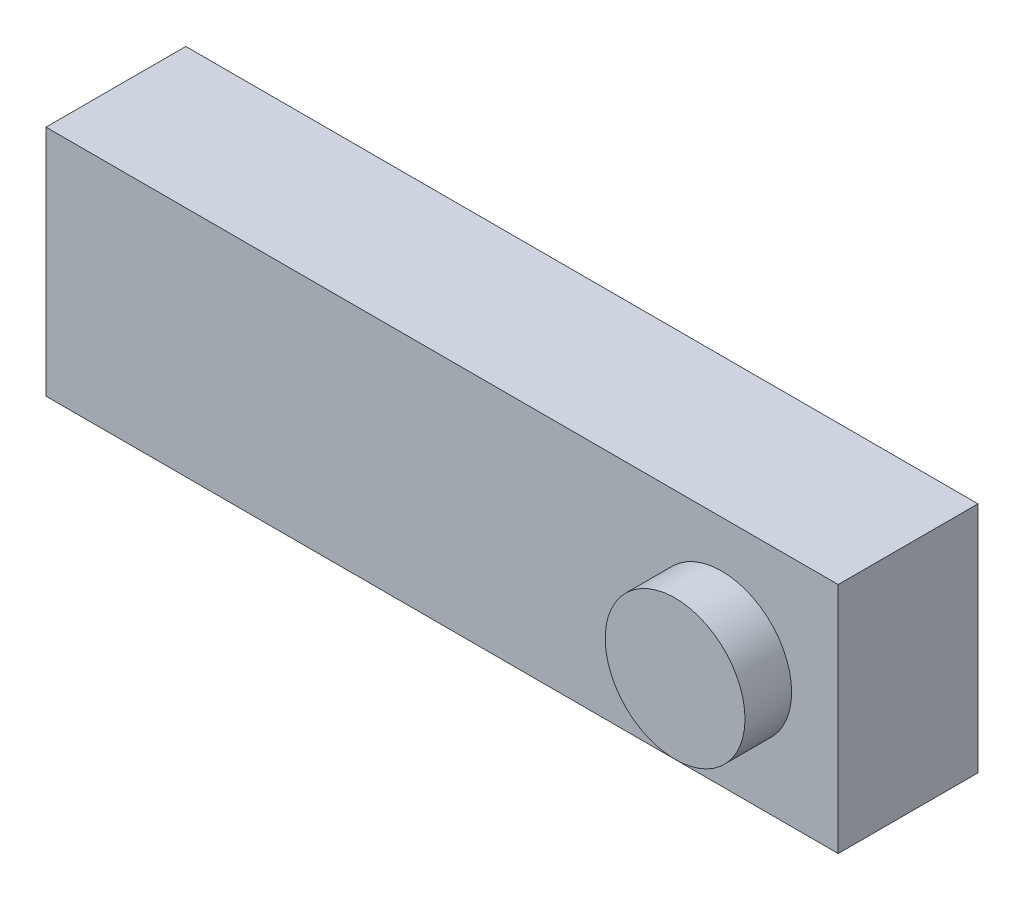
ISO-10303-21;
HEADER;
FILE_DESCRIPTION(('STEP AP214'),'2;1');
FILE_NAME('part.step','',(''),(''),'','','');
FILE_SCHEMA(('AUTOMOTIVE_DESIGN { 1 0 10303 214 1 1 1 1 }'));
ENDSEC;
DATA;
#1=APPLICATION_CONTEXT('core data for automotive mechanical design processes');
#2=APPLICATION_PROTOCOL_DEFINITION('international standard','automotive_design',2000,#1);
#3=PRODUCT_CONTEXT('',#1,'mechanical');
#4=PRODUCT('Part','Part','',(#3));
#5=PRODUCT_RELATED_PRODUCT_CATEGORY('part','',(#4));
#6=PRODUCT_DEFINITION_FORMATION('','',#4);
#7=PRODUCT_DEFINITION_CONTEXT('part definition',#1,'design');
#8=PRODUCT_DEFINITION('design','',#6,#7);
#9=PRODUCT_DEFINITION_SHAPE('','',#8);
#10=(LENGTH_UNIT() NAMED_UNIT(*) SI_UNIT(.MILLI.,.METRE.));
#11=(NAMED_UNIT(*) PLANE_ANGLE_UNIT() SI_UNIT($,.RADIAN.));
#12=(NAMED_UNIT(*) SI_UNIT($,.STERADIAN.) SOLID_ANGLE_UNIT());
#13=UNCERTAINTY_MEASURE_WITH_UNIT(LENGTH_MEASURE(1.E-05),#10,'distance_accuracy_value','');
#14=(GEOMETRIC_REPRESENTATION_CONTEXT(3) GLOBAL_UNCERTAINTY_ASSIGNED_CONTEXT((#13)) GLOBAL_UNIT_ASSIGNED_CONTEXT((#10,
#11,#12)) REPRESENTATION_CONTEXT('',''));
#15=CARTESIAN_POINT('',(0.,0.,0.));
#16=DIRECTION('',(0.,0.,1.));
#17=DIRECTION('',(1.,0.,0.));
#18=AXIS2_PLACEMENT_3D('',#15,#16,#17);
#19=CARTESIAN_POINT('',(491.834843653032,1149.02699768533,153.1716134156));
#20=DIRECTION('',(1.,0.,0.));
#21=DIRECTION('',(0.,0.,-1.));
#22=AXIS2_PLACEMENT_3D('',#19,#20,#21);
#23=PLANE('',#22);
#24=DIRECTION('',(0.,-1.,0.));
#25=VECTOR('',#24,1.);
#26=CARTESIAN_POINT('',(491.834843653032,1149.02699768533,3.17161341559968));
#27=LINE('',#26,#25);
#28=CARTESIAN_POINT('',(491.834843653032,1149.02699768533,3.17161341559968));
#29=VERTEX_POINT('',#28);
#30=CARTESIAN_POINT('',(491.834843653032,899.026997685325,3.17161341559968));
#31=VERTEX_POINT('',#30);
#32=EDGE_CURVE('E96',#29,#31,#27,.T.);
#33=ORIENTED_EDGE('',*,*,#32,.T.);
#34=DIRECTION('',(0.,0.,-1.));
#35=VECTOR('',#34,1.);
#36=CARTESIAN_POINT('',(491.834843653032,899.026997685325,153.1716134156));
#37=LINE('',#36,#35);
#38=CARTESIAN_POINT('',(491.834843653032,899.026997685325,153.1716134156));
#39=VERTEX_POINT('',#38);
#40=EDGE_CURVE('E11',#39,#31,#37,.T.);
#41=ORIENTED_EDGE('',*,*,#40,.F.);
#42=DIRECTION('',(0.,-1.,0.));
#43=VECTOR('',#42,1.);
#44=CARTESIAN_POINT('',(491.834843653032,1149.02699768533,153.1716134156));
#45=LINE('',#44,#43);
#46=CARTESIAN_POINT('',(491.834843653032,1149.02699768533,153.1716134156));
#47=VERTEX_POINT('',#46);
#48=EDGE_CURVE('E84',#47,#39,#45,.T.);
#49=ORIENTED_EDGE('',*,*,#48,.F.);
#50=DIRECTION('',(0.,0.,-1.));
#51=VECTOR('',#50,1.);
#52=CARTESIAN_POINT('',(491.834843653032,1149.02699768533,153.1716134156));
#53=LINE('',#52,#51);
#54=EDGE_CURVE('E92',#47,#29,#53,.T.);
#55=ORIENTED_EDGE('',*,*,#54,.T.);
#56=EDGE_LOOP('',(#33,#41,#49,#55));
#57=FACE_BOUND('',#56,.T.);
#58=ADVANCED_FACE('F33',(#57),#23,.F.);
#59=CARTESIAN_POINT('',(491.834843653032,899.026997685325,153.1716134156));
#60=DIRECTION('',(0.,1.,0.));
#61=DIRECTION('',(0.,0.,1.));
#62=AXIS2_PLACEMENT_3D('',#59,#60,#61);
#63=PLANE('',#62);
#64=DIRECTION('',(1.,0.,0.));
#65=VECTOR('',#64,1.);
#66=CARTESIAN_POINT('',(491.834843653032,899.026997685325,3.17161341559968));
#67=LINE('',#66,#65);
#68=CARTESIAN_POINT('',(1341.83484365303,899.026997685325,3.17161341559968));
#69=VERTEX_POINT('',#68);
#70=EDGE_CURVE('E88',#31,#69,#67,.T.);
#71=ORIENTED_EDGE('',*,*,#70,.T.);
#72=DIRECTION('',(0.,0.,-1.));
#73=VECTOR('',#72,1.);
#74=CARTESIAN_POINT('',(1341.83484365303,899.026997685325,153.1716134156));
#75=LINE('',#74,#73);
#76=CARTESIAN_POINT('',(1341.83484365303,899.026997685325,153.1716134156));
#77=VERTEX_POINT('',#76);
#78=EDGE_CURVE('E41',#77,#69,#75,.T.);
#79=ORIENTED_EDGE('',*,*,#78,.F.);
#80=DIRECTION('',(1.,0.,0.));
#81=VECTOR('',#80,1.);
#82=CARTESIAN_POINT('',(491.834843653032,899.026997685325,153.1716134156));
#83=LINE('',#82,#81);
#84=EDGE_CURVE('E79',#39,#77,#83,.T.);
#85=ORIENTED_EDGE('',*,*,#84,.F.);
#86=ORIENTED_EDGE('',*,*,#40,.T.);
#87=EDGE_LOOP('',(#71,#79,#85,#86));
#88=FACE_BOUND('',#87,.T.);
#89=ADVANCED_FACE('F87',(#88),#63,.F.);
#90=CARTESIAN_POINT('',(1341.83484365303,1149.02699768533,153.1716134156));
#91=DIRECTION('',(-1.,0.,0.));
#92=DIRECTION('',(0.,0.,1.));
#93=AXIS2_PLACEMENT_3D('',#90,#91,#92);
#94=PLANE('',#93);
#95=DIRECTION('',(0.,1.,0.));
#96=VECTOR('',#95,1.);
#97=CARTESIAN_POINT('',(1341.83484365303,1149.02699768533,3.17161341559968));
#98=LINE('',#97,#96);
#99=CARTESIAN_POINT('',(1341.83484365303,1149.02699768533,3.17161341559968));
#100=VERTEX_POINT('',#99);
#101=EDGE_CURVE('E66',#69,#100,#98,.T.);
#102=ORIENTED_EDGE('',*,*,#101,.T.);
#103=DIRECTION('',(0.,0.,-1.));
#104=VECTOR('',#103,1.);
#105=CARTESIAN_POINT('',(1341.83484365303,1149.02699768533,153.1716134156));
#106=LINE('',#105,#104);
#107=CARTESIAN_POINT('',(1341.83484365303,1149.02699768533,153.1716134156));
#108=VERTEX_POINT('',#107);
#109=EDGE_CURVE('E89',#108,#100,#106,.T.);
#110=ORIENTED_EDGE('',*,*,#109,.F.);
#111=DIRECTION('',(0.,1.,0.));
#112=VECTOR('',#111,1.);
#113=CARTESIAN_POINT('',(1341.83484365303,1149.02699768533,153.1716134156));
#114=LINE('',#113,#112);
#115=EDGE_CURVE('E82',#77,#108,#114,.T.);
#116=ORIENTED_EDGE('',*,*,#115,.F.);
#117=ORIENTED_EDGE('',*,*,#78,.T.);
#118=EDGE_LOOP('',(#102,#110,#116,#117));
#119=FACE_BOUND('',#118,.T.);
#120=ADVANCED_FACE('F90',(#119),#94,.F.);
#121=CARTESIAN_POINT('',(491.834843653032,1149.02699768533,153.1716134156));
#122=DIRECTION('',(0.,-1.,0.));
#123=DIRECTION('',(0.,0.,-1.));
#124=AXIS2_PLACEMENT_3D('',#121,#122,#123);
#125=PLANE('',#124);
#126=DIRECTION('',(-1.,0.,0.));
#127=VECTOR('',#126,1.);
#128=CARTESIAN_POINT('',(491.834843653032,1149.02699768533,3.17161341559968));
#129=LINE('',#128,#127);
#130=EDGE_CURVE('E72',#100,#29,#129,.T.);
#131=ORIENTED_EDGE('',*,*,#130,.T.);
#132=ORIENTED_EDGE('',*,*,#54,.F.);
#133=DIRECTION('',(-1.,0.,0.));
#134=VECTOR('',#133,1.);
#135=CARTESIAN_POINT('',(491.834843653032,1149.02699768533,153.1716134156));
#136=LINE('',#135,#134);
#137=EDGE_CURVE('E49',#108,#47,#136,.T.);
#138=ORIENTED_EDGE('',*,*,#137,.F.);
#139=ORIENTED_EDGE('',*,*,#109,.T.);
#140=EDGE_LOOP('',(#131,#132,#138,#139));
#141=FACE_BOUND('',#140,.T.);
#142=ADVANCED_FACE('F104',(#141),#125,.F.);
#143=CARTESIAN_POINT('',(0.,0.,153.1716134156));
#144=DIRECTION('',(0.,0.,1.));
#145=DIRECTION('',(1.,0.,0.));
#146=AXIS2_PLACEMENT_3D('',#143,#144,#145);
#147=PLANE('',#146);
#148=CARTESIAN_POINT('',(1216.83484365303,1024.02699768533,153.1716134156));
#149=DIRECTION('',(0.,0.,1.));
#150=DIRECTION('',(1.,0.,0.));
#151=AXIS2_PLACEMENT_3D('',#148,#149,#150);
#152=CIRCLE('',#151,75.);
#153=CARTESIAN_POINT('',(1291.83484365303,1024.02699768533,153.1716134156));
#154=VERTEX_POINT('',#153);
#155=EDGE_CURVE('E116',#154,#154,#152,.T.);
#156=ORIENTED_EDGE('',*,*,#155,.F.);
#157=EDGE_LOOP('',(#156));
#158=FACE_BOUND('',#157,.T.);
#159=ORIENTED_EDGE('',*,*,#48,.T.);
#160=ORIENTED_EDGE('',*,*,#84,.T.);
#161=ORIENTED_EDGE('',*,*,#115,.T.);
#162=ORIENTED_EDGE('',*,*,#137,.T.);
#163=EDGE_LOOP('',(#159,#160,#161,#162));
#164=FACE_BOUND('',#163,.T.);
#165=ADVANCED_FACE('F80',(#158,#164),#147,.T.);
#166=CARTESIAN_POINT('',(0.,0.,3.17161341559968));
#167=DIRECTION('',(0.,0.,1.));
#168=DIRECTION('',(1.,0.,0.));
#169=AXIS2_PLACEMENT_3D('',#166,#167,#168);
#170=PLANE('',#169);
#171=CARTESIAN_POINT('',(616.834843653032,1024.02699768533,3.17161341559968));
#172=DIRECTION('',(0.,0.,-1.));
#173=DIRECTION('',(-1.,0.,0.));
#174=AXIS2_PLACEMENT_3D('',#171,#172,#173);
#175=CIRCLE('',#174,75.);
#176=CARTESIAN_POINT('',(541.834843653032,1024.02699768533,3.17161341559968));
#177=VERTEX_POINT('',#176);
#178=EDGE_CURVE('E110',#177,#177,#175,.T.);
#179=ORIENTED_EDGE('',*,*,#178,.F.);
#180=EDGE_LOOP('',(#179));
#181=FACE_BOUND('',#180,.T.);
#182=ORIENTED_EDGE('',*,*,#32,.F.);
#183=ORIENTED_EDGE('',*,*,#130,.F.);
#184=ORIENTED_EDGE('',*,*,#101,.F.);
#185=ORIENTED_EDGE('',*,*,#70,.F.);
#186=EDGE_LOOP('',(#182,#183,#184,#185));
#187=FACE_BOUND('',#186,.T.);
#188=ADVANCED_FACE('F107',(#181,#187),#170,.F.);
#189=CARTESIAN_POINT('',(616.834843653032,1024.02699768533,53.1716134155997));
#190=DIRECTION('',(0.,0.,-1.));
#191=DIRECTION('',(-1.,0.,0.));
#192=AXIS2_PLACEMENT_3D('',#189,#190,#191);
#193=CYLINDRICAL_SURFACE('',#192,75.);
#194=CARTESIAN_POINT('',(616.834843653032,1024.02699768533,53.1716134155997));
#195=DIRECTION('',(0.,0.,-1.));
#196=DIRECTION('',(-1.,0.,0.));
#197=AXIS2_PLACEMENT_3D('',#194,#195,#196);
#198=CIRCLE('',#197,75.);
#199=CARTESIAN_POINT('',(541.834843653032,1024.02699768533,53.1716134155997));
#200=VERTEX_POINT('',#199);
#201=EDGE_CURVE('E99',#200,#200,#198,.T.);
#202=ORIENTED_EDGE('',*,*,#201,.F.);
#203=EDGE_LOOP('',(#202));
#204=FACE_BOUND('',#203,.T.);
#205=ORIENTED_EDGE('',*,*,#178,.T.);
#206=EDGE_LOOP('',(#205));
#207=FACE_BOUND('',#206,.T.);
#208=ADVANCED_FACE('F138',(#204,#207),#193,.F.);
#209=CARTESIAN_POINT('',(616.834843653032,1024.02699768533,53.1716134155997));
#210=DIRECTION('',(0.,0.,-1.));
#211=DIRECTION('',(-1.,0.,0.));
#212=AXIS2_PLACEMENT_3D('',#209,#210,#211);
#213=PLANE('',#212);
#214=ORIENTED_EDGE('',*,*,#201,.T.);
#215=EDGE_LOOP('',(#214));
#216=FACE_BOUND('',#215,.T.);
#217=ADVANCED_FACE('F127',(#216),#213,.T.);
#218=CARTESIAN_POINT('',(1216.83484365303,1024.02699768533,203.1716134156));
#219=DIRECTION('',(0.,0.,-1.));
#220=DIRECTION('',(-1.,0.,0.));
#221=AXIS2_PLACEMENT_3D('',#218,#219,#220);
#222=CYLINDRICAL_SURFACE('',#221,75.);
#223=CARTESIAN_POINT('',(1216.83484365303,1024.02699768533,203.1716134156));
#224=DIRECTION('',(0.,0.,1.));
#225=DIRECTION('',(1.,0.,0.));
#226=AXIS2_PLACEMENT_3D('',#223,#224,#225);
#227=CIRCLE('',#226,75.);
#228=CARTESIAN_POINT('',(1291.83484365303,1024.02699768533,203.1716134156));
#229=VERTEX_POINT('',#228);
#230=EDGE_CURVE('E113',#229,#229,#227,.T.);
#231=ORIENTED_EDGE('',*,*,#230,.F.);
#232=EDGE_LOOP('',(#231));
#233=FACE_BOUND('',#232,.T.);
#234=ORIENTED_EDGE('',*,*,#155,.T.);
#235=EDGE_LOOP('',(#234));
#236=FACE_BOUND('',#235,.T.);
#237=ADVANCED_FACE('F124',(#233,#236),#222,.T.);
#238=CARTESIAN_POINT('',(1216.83484365303,1024.02699768533,203.1716134156));
#239=DIRECTION('',(0.,0.,1.));
#240=DIRECTION('',(1.,0.,0.));
#241=AXIS2_PLACEMENT_3D('',#238,#239,#240);
#242=PLANE('',#241);
#243=ORIENTED_EDGE('',*,*,#230,.T.);
#244=EDGE_LOOP('',(#243));
#245=FACE_BOUND('',#244,.T.);
#246=ADVANCED_FACE('F122',(#245),#242,.T.);
#247=CLOSED_SHELL('',(#58,#89,#120,#142,#165,#188,#208,#217,#237,#246));
#248=MANIFOLD_SOLID_BREP('B2',#247);
#249=ADVANCED_BREP_SHAPE_REPRESENTATION('',(#18,#248),#14);
#250=SHAPE_DEFINITION_REPRESENTATION(#9,#249);
ENDSEC;
END-ISO-10303-21;
